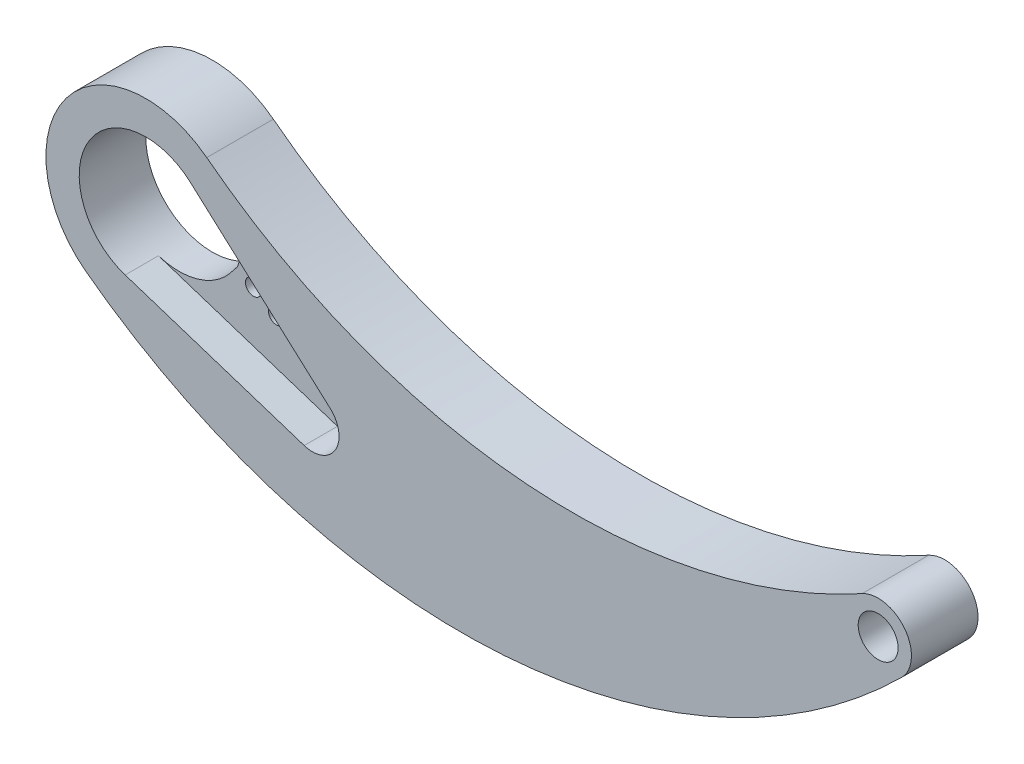
ISO-10303-21;
HEADER;
FILE_DESCRIPTION(('STEP AP214'),'2;1');
FILE_NAME('part.step','',(''),(''),'','','');
FILE_SCHEMA(('AUTOMOTIVE_DESIGN { 1 0 10303 214 1 1 1 1 }'));
ENDSEC;
DATA;
#1=APPLICATION_CONTEXT('core data for automotive mechanical design processes');
#2=APPLICATION_PROTOCOL_DEFINITION('international standard','automotive_design',2000,#1);
#3=PRODUCT_CONTEXT('',#1,'mechanical');
#4=PRODUCT('Part','Part','',(#3));
#5=PRODUCT_RELATED_PRODUCT_CATEGORY('part','',(#4));
#6=PRODUCT_DEFINITION_FORMATION('','',#4);
#7=PRODUCT_DEFINITION_CONTEXT('part definition',#1,'design');
#8=PRODUCT_DEFINITION('design','',#6,#7);
#9=PRODUCT_DEFINITION_SHAPE('','',#8);
#10=(LENGTH_UNIT() NAMED_UNIT(*) SI_UNIT(.MILLI.,.METRE.));
#11=(NAMED_UNIT(*) PLANE_ANGLE_UNIT() SI_UNIT($,.RADIAN.));
#12=(NAMED_UNIT(*) SI_UNIT($,.STERADIAN.) SOLID_ANGLE_UNIT());
#13=UNCERTAINTY_MEASURE_WITH_UNIT(LENGTH_MEASURE(1.E-05),#10,'distance_accuracy_value','');
#14=(GEOMETRIC_REPRESENTATION_CONTEXT(3) GLOBAL_UNCERTAINTY_ASSIGNED_CONTEXT((#13)) GLOBAL_UNIT_ASSIGNED_CONTEXT((#10,
#11,#12)) REPRESENTATION_CONTEXT('',''));
#15=CARTESIAN_POINT('',(0.,0.,0.));
#16=DIRECTION('',(0.,0.,1.));
#17=DIRECTION('',(1.,0.,0.));
#18=AXIS2_PLACEMENT_3D('',#15,#16,#17);
#19=CARTESIAN_POINT('',(0.,0.,5.));
#20=DIRECTION('',(0.,0.,-1.));
#21=DIRECTION('',(-1.,0.,0.));
#22=AXIS2_PLACEMENT_3D('',#19,#20,#21);
#23=CYLINDRICAL_SURFACE('',#22,5.);
#24=CARTESIAN_POINT('',(0.,0.,5.));
#25=DIRECTION('',(0.,0.,1.));
#26=DIRECTION('',(1.,0.,0.));
#27=AXIS2_PLACEMENT_3D('',#24,#25,#26);
#28=CIRCLE('',#27,5.);
#29=CARTESIAN_POINT('',(3.34451620108525,3.71674741954284,5.));
#30=VERTEX_POINT('',#29);
#31=CARTESIAN_POINT('',(-1.54653958423174,-4.75480970327986,5.));
#32=VERTEX_POINT('',#31);
#33=EDGE_CURVE('E186',#30,#32,#28,.T.);
#34=ORIENTED_EDGE('',*,*,#33,.T.);
#35=DIRECTION('',(0.,0.,1.));
#36=VECTOR('',#35,1.);
#37=CARTESIAN_POINT('',(-1.54653958423174,-4.75480970327986,2.5));
#38=LINE('',#37,#36);
#39=CARTESIAN_POINT('',(-1.54653958423174,-4.75480970327986,2.5));
#40=VERTEX_POINT('',#39);
#41=EDGE_CURVE('E162',#40,#32,#38,.T.);
#42=ORIENTED_EDGE('',*,*,#41,.F.);
#43=CARTESIAN_POINT('',(0.,0.,2.5));
#44=DIRECTION('',(0.,0.,1.));
#45=DIRECTION('',(1.,0.,0.));
#46=AXIS2_PLACEMENT_3D('',#43,#44,#45);
#47=CIRCLE('',#46,5.);
#48=CARTESIAN_POINT('',(4.19748369054172,-2.71682363572542,2.5));
#49=VERTEX_POINT('',#48);
#50=EDGE_CURVE('E133',#49,#40,#47,.F.);
#51=ORIENTED_EDGE('',*,*,#50,.F.);
#52=DIRECTION('',(0.,0.,1.));
#53=VECTOR('',#52,1.);
#54=CARTESIAN_POINT('',(4.19748369054172,-2.71682363572542,0.));
#55=LINE('',#54,#53);
#56=CARTESIAN_POINT('',(4.19748369054172,-2.71682363572542,0.));
#57=VERTEX_POINT('',#56);
#58=EDGE_CURVE('E170',#57,#49,#55,.T.);
#59=ORIENTED_EDGE('',*,*,#58,.F.);
#60=CARTESIAN_POINT('',(0.,0.,0.));
#61=DIRECTION('',(0.,0.,1.));
#62=DIRECTION('',(1.,0.,0.));
#63=AXIS2_PLACEMENT_3D('',#60,#61,#62);
#64=CIRCLE('',#63,5.);
#65=CARTESIAN_POINT('',(4.45158013141107,-2.27671569011729,0.));
#66=VERTEX_POINT('',#65);
#67=EDGE_CURVE('E203',#66,#57,#64,.T.);
#68=ORIENTED_EDGE('',*,*,#67,.F.);
#69=DIRECTION('',(0.,0.,1.));
#70=VECTOR('',#69,1.);
#71=CARTESIAN_POINT('',(4.45158013141106,-2.27671569011729,0.));
#72=LINE('',#71,#70);
#73=CARTESIAN_POINT('',(4.45158013141106,-2.27671569011729,2.5));
#74=VERTEX_POINT('',#73);
#75=EDGE_CURVE('E56',#74,#66,#72,.F.);
#76=ORIENTED_EDGE('',*,*,#75,.F.);
#77=CARTESIAN_POINT('',(0.,0.,2.5));
#78=DIRECTION('',(0.,0.,1.));
#79=DIRECTION('',(1.,0.,0.));
#80=AXIS2_PLACEMENT_3D('',#77,#78,#79);
#81=CIRCLE('',#80,5.);
#82=CARTESIAN_POINT('',(3.34451620108525,3.71674741954284,2.5));
#83=VERTEX_POINT('',#82);
#84=EDGE_CURVE('E49',#83,#74,#81,.F.);
#85=ORIENTED_EDGE('',*,*,#84,.F.);
#86=DIRECTION('',(0.,0.,1.));
#87=VECTOR('',#86,1.);
#88=CARTESIAN_POINT('',(3.34451620108525,3.71674741954284,2.5));
#89=LINE('',#88,#87);
#90=EDGE_CURVE('E165',#83,#30,#89,.T.);
#91=ORIENTED_EDGE('',*,*,#90,.T.);
#92=EDGE_LOOP('',(#34,#42,#51,#59,#68,#76,#85,#91));
#93=FACE_BOUND('',#92,.T.);
#94=ADVANCED_FACE('F34',(#93),#23,.F.);
#95=CARTESIAN_POINT('',(12.5140670846851,-7.22500000000001,-5.));
#96=DIRECTION('',(0.,0.,1.));
#97=DIRECTION('',(1.,0.,0.));
#98=AXIS2_PLACEMENT_3D('',#95,#96,#97);
#99=CYLINDRICAL_SURFACE('',#98,0.6);
#100=CARTESIAN_POINT('',(12.5140670846851,-7.22500000000001,0.));
#101=DIRECTION('',(0.,0.,1.));
#102=DIRECTION('',(1.,0.,0.));
#103=AXIS2_PLACEMENT_3D('',#100,#101,#102);
#104=CIRCLE('',#103,0.6);
#105=CARTESIAN_POINT('',(13.1140670846851,-7.22500000000001,0.));
#106=VERTEX_POINT('',#105);
#107=EDGE_CURVE('E164',#106,#106,#104,.T.);
#108=ORIENTED_EDGE('',*,*,#107,.F.);
#109=EDGE_LOOP('',(#108));
#110=FACE_BOUND('',#109,.T.);
#111=CARTESIAN_POINT('',(12.5140670846851,-7.22500000000001,2.5));
#112=DIRECTION('',(0.,0.,1.));
#113=DIRECTION('',(1.,0.,0.));
#114=AXIS2_PLACEMENT_3D('',#111,#112,#113);
#115=CIRCLE('',#114,0.6);
#116=CARTESIAN_POINT('',(13.1140670846851,-7.22500000000001,2.5));
#117=VERTEX_POINT('',#116);
#118=EDGE_CURVE('E122',#117,#117,#115,.F.);
#119=ORIENTED_EDGE('',*,*,#118,.F.);
#120=EDGE_LOOP('',(#119));
#121=FACE_BOUND('',#120,.T.);
#122=ADVANCED_FACE('F250',(#110,#121),#99,.F.);
#123=CARTESIAN_POINT('',(10.7820162771163,-6.22500000000001,-5.));
#124=DIRECTION('',(0.,0.,1.));
#125=DIRECTION('',(1.,0.,0.));
#126=AXIS2_PLACEMENT_3D('',#123,#124,#125);
#127=CYLINDRICAL_SURFACE('',#126,0.600000000000002);
#128=CARTESIAN_POINT('',(10.7820162771163,-6.22500000000001,0.));
#129=DIRECTION('',(0.,0.,1.));
#130=DIRECTION('',(1.,0.,0.));
#131=AXIS2_PLACEMENT_3D('',#128,#129,#130);
#132=CIRCLE('',#131,0.600000000000002);
#133=CARTESIAN_POINT('',(11.3820162771163,-6.22500000000001,0.));
#134=VERTEX_POINT('',#133);
#135=EDGE_CURVE('E218',#134,#134,#132,.T.);
#136=ORIENTED_EDGE('',*,*,#135,.F.);
#137=EDGE_LOOP('',(#136));
#138=FACE_BOUND('',#137,.T.);
#139=CARTESIAN_POINT('',(10.7820162771163,-6.22500000000001,2.5));
#140=DIRECTION('',(0.,0.,1.));
#141=DIRECTION('',(1.,0.,0.));
#142=AXIS2_PLACEMENT_3D('',#139,#140,#141);
#143=CIRCLE('',#142,0.600000000000002);
#144=CARTESIAN_POINT('',(11.3820162771163,-6.22500000000001,2.5));
#145=VERTEX_POINT('',#144);
#146=EDGE_CURVE('E155',#145,#145,#143,.F.);
#147=ORIENTED_EDGE('',*,*,#146,.F.);
#148=EDGE_LOOP('',(#147));
#149=FACE_BOUND('',#148,.T.);
#150=ADVANCED_FACE('F252',(#138,#149),#127,.F.);
#151=CARTESIAN_POINT('',(9.04996546954738,-5.22500000000001,-5.));
#152=DIRECTION('',(0.,0.,1.));
#153=DIRECTION('',(1.,0.,0.));
#154=AXIS2_PLACEMENT_3D('',#151,#152,#153);
#155=CYLINDRICAL_SURFACE('',#154,0.6);
#156=CARTESIAN_POINT('',(9.04996546954738,-5.22500000000001,0.));
#157=DIRECTION('',(0.,0.,1.));
#158=DIRECTION('',(1.,0.,0.));
#159=AXIS2_PLACEMENT_3D('',#156,#157,#158);
#160=CIRCLE('',#159,0.6);
#161=CARTESIAN_POINT('',(9.64996546954738,-5.22500000000001,0.));
#162=VERTEX_POINT('',#161);
#163=EDGE_CURVE('E221',#162,#162,#160,.T.);
#164=ORIENTED_EDGE('',*,*,#163,.F.);
#165=EDGE_LOOP('',(#164));
#166=FACE_BOUND('',#165,.T.);
#167=CARTESIAN_POINT('',(9.04996546954738,-5.22500000000001,2.5));
#168=DIRECTION('',(0.,0.,1.));
#169=DIRECTION('',(1.,0.,0.));
#170=AXIS2_PLACEMENT_3D('',#167,#168,#169);
#171=CIRCLE('',#170,0.6);
#172=CARTESIAN_POINT('',(9.64996546954738,-5.22500000000001,2.5));
#173=VERTEX_POINT('',#172);
#174=EDGE_CURVE('E152',#173,#173,#171,.F.);
#175=ORIENTED_EDGE('',*,*,#174,.F.);
#176=EDGE_LOOP('',(#175));
#177=FACE_BOUND('',#176,.T.);
#178=ADVANCED_FACE('F259',(#166,#177),#155,.F.);
#179=CARTESIAN_POINT('',(7.3179146619785,-4.22500000000001,-5.));
#180=DIRECTION('',(0.,0.,1.));
#181=DIRECTION('',(1.,0.,0.));
#182=AXIS2_PLACEMENT_3D('',#179,#180,#181);
#183=CYLINDRICAL_SURFACE('',#182,0.6);
#184=CARTESIAN_POINT('',(7.3179146619785,-4.22500000000001,0.));
#185=DIRECTION('',(0.,0.,1.));
#186=DIRECTION('',(1.,0.,0.));
#187=AXIS2_PLACEMENT_3D('',#184,#185,#186);
#188=CIRCLE('',#187,0.6);
#189=CARTESIAN_POINT('',(7.9179146619785,-4.22500000000001,0.));
#190=VERTEX_POINT('',#189);
#191=EDGE_CURVE('E224',#190,#190,#188,.T.);
#192=ORIENTED_EDGE('',*,*,#191,.F.);
#193=EDGE_LOOP('',(#192));
#194=FACE_BOUND('',#193,.T.);
#195=CARTESIAN_POINT('',(7.3179146619785,-4.22500000000001,2.5));
#196=DIRECTION('',(0.,0.,1.));
#197=DIRECTION('',(1.,0.,0.));
#198=AXIS2_PLACEMENT_3D('',#195,#196,#197);
#199=CIRCLE('',#198,0.6);
#200=CARTESIAN_POINT('',(7.9179146619785,-4.22500000000001,2.5));
#201=VERTEX_POINT('',#200);
#202=EDGE_CURVE('E149',#201,#201,#199,.F.);
#203=ORIENTED_EDGE('',*,*,#202,.F.);
#204=EDGE_LOOP('',(#203));
#205=FACE_BOUND('',#204,.T.);
#206=ADVANCED_FACE('F236',(#194,#205),#183,.F.);
#207=CARTESIAN_POINT('',(5.58586385440963,-3.22500000000001,-5.));
#208=DIRECTION('',(0.,0.,1.));
#209=DIRECTION('',(1.,0.,0.));
#210=AXIS2_PLACEMENT_3D('',#207,#208,#209);
#211=CYLINDRICAL_SURFACE('',#210,0.6);
#212=CARTESIAN_POINT('',(5.58586385440963,-3.22500000000001,0.));
#213=DIRECTION('',(0.,0.,1.));
#214=DIRECTION('',(1.,0.,0.));
#215=AXIS2_PLACEMENT_3D('',#212,#213,#214);
#216=CIRCLE('',#215,0.6);
#217=CARTESIAN_POINT('',(6.18586385440963,-3.22500000000001,0.));
#218=VERTEX_POINT('',#217);
#219=EDGE_CURVE('E171',#218,#218,#216,.T.);
#220=ORIENTED_EDGE('',*,*,#219,.F.);
#221=EDGE_LOOP('',(#220));
#222=FACE_BOUND('',#221,.T.);
#223=CARTESIAN_POINT('',(5.58586385440963,-3.22500000000001,2.5));
#224=DIRECTION('',(0.,0.,1.));
#225=DIRECTION('',(1.,0.,0.));
#226=AXIS2_PLACEMENT_3D('',#223,#224,#225);
#227=CIRCLE('',#226,0.6);
#228=CARTESIAN_POINT('',(6.18586385440963,-3.22500000000001,2.5));
#229=VERTEX_POINT('',#228);
#230=EDGE_CURVE('E146',#229,#229,#227,.F.);
#231=ORIENTED_EDGE('',*,*,#230,.F.);
#232=EDGE_LOOP('',(#231));
#233=FACE_BOUND('',#232,.T.);
#234=ADVANCED_FACE('F232',(#222,#233),#211,.F.);
#235=CARTESIAN_POINT('',(3.85381304684075,-2.225,-5.));
#236=DIRECTION('',(0.,0.,1.));
#237=DIRECTION('',(1.,0.,0.));
#238=AXIS2_PLACEMENT_3D('',#235,#236,#237);
#239=CYLINDRICAL_SURFACE('',#238,0.600000000000001);
#240=CARTESIAN_POINT('',(3.85381304684075,-2.225,2.5));
#241=DIRECTION('',(0.,0.,1.));
#242=DIRECTION('',(1.,0.,0.));
#243=AXIS2_PLACEMENT_3D('',#240,#241,#242);
#244=CIRCLE('',#243,0.600000000000001);
#245=EDGE_CURVE('E143',#74,#49,#244,.F.);
#246=ORIENTED_EDGE('',*,*,#245,.F.);
#247=ORIENTED_EDGE('',*,*,#75,.T.);
#248=CARTESIAN_POINT('',(3.85381304684075,-2.225,0.));
#249=DIRECTION('',(0.,0.,1.));
#250=DIRECTION('',(1.,0.,0.));
#251=AXIS2_PLACEMENT_3D('',#248,#249,#250);
#252=CIRCLE('',#251,0.600000000000001);
#253=EDGE_CURVE('E11',#57,#66,#252,.T.);
#254=ORIENTED_EDGE('',*,*,#253,.F.);
#255=ORIENTED_EDGE('',*,*,#58,.T.);
#256=EDGE_LOOP('',(#246,#247,#254,#255));
#257=FACE_BOUND('',#256,.T.);
#258=ADVANCED_FACE('F235',(#257),#239,.F.);
#259=CARTESIAN_POINT('',(23.681818181818,31.6136281942348,5.));
#260=DIRECTION('',(0.,0.,-1.));
#261=DIRECTION('',(-1.,0.,0.));
#262=AXIS2_PLACEMENT_3D('',#259,#260,#261);
#263=CYLINDRICAL_SURFACE('',#262,47.);
#264=CARTESIAN_POINT('',(23.681818181818,31.6136281942348,0.));
#265=DIRECTION('',(0.,0.,1.));
#266=DIRECTION('',(1.,0.,0.));
#267=AXIS2_PLACEMENT_3D('',#264,#265,#266);
#268=CIRCLE('',#267,47.);
#269=CARTESIAN_POINT('',(-4.4965477560414,-6.00258763181672,0.));
#270=VERTEX_POINT('',#269);
#271=CARTESIAN_POINT('',(56.7594484167518,-1.77604652776559,0.));
#272=VERTEX_POINT('',#271);
#273=EDGE_CURVE('E174',#270,#272,#268,.T.);
#274=ORIENTED_EDGE('',*,*,#273,.T.);
#275=DIRECTION('',(0.,0.,-1.));
#276=VECTOR('',#275,1.);
#277=CARTESIAN_POINT('',(56.7594484167518,-1.77604652776559,5.));
#278=LINE('',#277,#276);
#279=CARTESIAN_POINT('',(56.7594484167518,-1.77604652776559,5.));
#280=VERTEX_POINT('',#279);
#281=EDGE_CURVE('E42',#280,#272,#278,.T.);
#282=ORIENTED_EDGE('',*,*,#281,.F.);
#283=CARTESIAN_POINT('',(23.681818181818,31.6136281942348,5.));
#284=DIRECTION('',(0.,0.,1.));
#285=DIRECTION('',(1.,0.,0.));
#286=AXIS2_PLACEMENT_3D('',#283,#284,#285);
#287=CIRCLE('',#286,47.);
#288=CARTESIAN_POINT('',(-4.4965477560414,-6.00258763181672,5.));
#289=VERTEX_POINT('',#288);
#290=EDGE_CURVE('E175',#289,#280,#287,.T.);
#291=ORIENTED_EDGE('',*,*,#290,.F.);
#292=DIRECTION('',(0.,0.,-1.));
#293=VECTOR('',#292,1.);
#294=CARTESIAN_POINT('',(-4.4965477560414,-6.00258763181672,5.));
#295=LINE('',#294,#293);
#296=EDGE_CURVE('E192',#289,#270,#295,.T.);
#297=ORIENTED_EDGE('',*,*,#296,.T.);
#298=EDGE_LOOP('',(#274,#282,#291,#297));
#299=FACE_BOUND('',#298,.T.);
#300=ADVANCED_FACE('F36',(#299),#263,.T.);
#301=CARTESIAN_POINT('',(55.,4.04269619458676E-13,5.));
#302=DIRECTION('',(0.,0.,-1.));
#303=DIRECTION('',(-1.,0.,0.));
#304=AXIS2_PLACEMENT_3D('',#301,#302,#303);
#305=CYLINDRICAL_SURFACE('',#304,2.5);
#306=CARTESIAN_POINT('',(55.,4.04269619458676E-13,0.));
#307=DIRECTION('',(0.,0.,1.));
#308=DIRECTION('',(1.,0.,0.));
#309=AXIS2_PLACEMENT_3D('',#306,#307,#308);
#310=CIRCLE('',#309,2.5);
#311=CARTESIAN_POINT('',(53.7918660287081,2.18870105482961,0.));
#312=VERTEX_POINT('',#311);
#313=EDGE_CURVE('E195',#272,#312,#310,.T.);
#314=ORIENTED_EDGE('',*,*,#313,.T.);
#315=DIRECTION('',(0.,0.,-1.));
#316=VECTOR('',#315,1.);
#317=CARTESIAN_POINT('',(53.7918660287081,2.18870105482961,5.));
#318=LINE('',#317,#316);
#319=CARTESIAN_POINT('',(53.7918660287081,2.18870105482961,5.));
#320=VERTEX_POINT('',#319);
#321=EDGE_CURVE('E212',#320,#312,#318,.T.);
#322=ORIENTED_EDGE('',*,*,#321,.F.);
#323=CARTESIAN_POINT('',(55.,4.04269619458676E-13,5.));
#324=DIRECTION('',(0.,0.,1.));
#325=DIRECTION('',(1.,0.,0.));
#326=AXIS2_PLACEMENT_3D('',#323,#324,#325);
#327=CIRCLE('',#326,2.5);
#328=EDGE_CURVE('E178',#280,#320,#327,.T.);
#329=ORIENTED_EDGE('',*,*,#328,.F.);
#330=ORIENTED_EDGE('',*,*,#281,.T.);
#331=EDGE_LOOP('',(#314,#322,#329,#330));
#332=FACE_BOUND('',#331,.T.);
#333=ADVANCED_FACE('F283',(#332),#305,.T.);
#334=CARTESIAN_POINT('',(32.0454545454542,41.5853200417554,5.));
#335=DIRECTION('',(0.,0.,-1.));
#336=DIRECTION('',(-1.,0.,0.));
#337=AXIS2_PLACEMENT_3D('',#334,#335,#336);
#338=CYLINDRICAL_SURFACE('',#337,45.);
#339=CARTESIAN_POINT('',(32.0454545454542,41.5853200417554,0.));
#340=DIRECTION('',(0.,0.,1.));
#341=DIRECTION('',(1.,0.,0.));
#342=AXIS2_PLACEMENT_3D('',#339,#340,#341);
#343=CIRCLE('',#342,45.);
#344=CARTESIAN_POINT('',(4.57792207792204,5.94076000596506,0.));
#345=VERTEX_POINT('',#344);
#346=EDGE_CURVE('E198',#345,#312,#343,.T.);
#347=ORIENTED_EDGE('',*,*,#346,.F.);
#348=DIRECTION('',(0.,0.,-1.));
#349=VECTOR('',#348,1.);
#350=CARTESIAN_POINT('',(4.57792207792204,5.94076000596506,5.));
#351=LINE('',#350,#349);
#352=CARTESIAN_POINT('',(4.57792207792204,5.94076000596506,5.));
#353=VERTEX_POINT('',#352);
#354=EDGE_CURVE('E210',#353,#345,#351,.T.);
#355=ORIENTED_EDGE('',*,*,#354,.F.);
#356=CARTESIAN_POINT('',(32.0454545454542,41.5853200417554,5.));
#357=DIRECTION('',(0.,0.,1.));
#358=DIRECTION('',(1.,0.,0.));
#359=AXIS2_PLACEMENT_3D('',#356,#357,#358);
#360=CIRCLE('',#359,45.);
#361=EDGE_CURVE('E181',#353,#320,#360,.T.);
#362=ORIENTED_EDGE('',*,*,#361,.T.);
#363=ORIENTED_EDGE('',*,*,#321,.T.);
#364=EDGE_LOOP('',(#347,#355,#362,#363));
#365=FACE_BOUND('',#364,.T.);
#366=ADVANCED_FACE('F280',(#365),#338,.F.);
#367=CARTESIAN_POINT('',(0.,0.,5.));
#368=DIRECTION('',(0.,0.,-1.));
#369=DIRECTION('',(-1.,0.,0.));
#370=AXIS2_PLACEMENT_3D('',#367,#368,#369);
#371=CYLINDRICAL_SURFACE('',#370,7.5);
#372=CARTESIAN_POINT('',(0.,0.,0.));
#373=DIRECTION('',(0.,0.,1.));
#374=DIRECTION('',(1.,0.,0.));
#375=AXIS2_PLACEMENT_3D('',#372,#373,#374);
#376=CIRCLE('',#375,7.5);
#377=EDGE_CURVE('E201',#345,#270,#376,.T.);
#378=ORIENTED_EDGE('',*,*,#377,.T.);
#379=ORIENTED_EDGE('',*,*,#296,.F.);
#380=CARTESIAN_POINT('',(0.,0.,5.));
#381=DIRECTION('',(0.,0.,1.));
#382=DIRECTION('',(1.,0.,0.));
#383=AXIS2_PLACEMENT_3D('',#380,#381,#382);
#384=CIRCLE('',#383,7.5);
#385=EDGE_CURVE('E184',#353,#289,#384,.T.);
#386=ORIENTED_EDGE('',*,*,#385,.F.);
#387=ORIENTED_EDGE('',*,*,#354,.T.);
#388=EDGE_LOOP('',(#378,#379,#386,#387));
#389=FACE_BOUND('',#388,.T.);
#390=ADVANCED_FACE('F275',(#389),#371,.T.);
#391=CARTESIAN_POINT('',(55.,4.04269619458676E-13,5.));
#392=DIRECTION('',(0.,0.,-1.));
#393=DIRECTION('',(-1.,0.,0.));
#394=AXIS2_PLACEMENT_3D('',#391,#392,#393);
#395=CYLINDRICAL_SURFACE('',#394,1.5);
#396=CARTESIAN_POINT('',(55.,4.04269619458676E-13,5.));
#397=DIRECTION('',(0.,0.,1.));
#398=DIRECTION('',(1.,0.,0.));
#399=AXIS2_PLACEMENT_3D('',#396,#397,#398);
#400=CIRCLE('',#399,1.5);
#401=CARTESIAN_POINT('',(56.5,4.04269619458676E-13,5.));
#402=VERTEX_POINT('',#401);
#403=EDGE_CURVE('E189',#402,#402,#400,.T.);
#404=ORIENTED_EDGE('',*,*,#403,.T.);
#405=EDGE_LOOP('',(#404));
#406=FACE_BOUND('',#405,.T.);
#407=CARTESIAN_POINT('',(55.,4.04269619458676E-13,0.));
#408=DIRECTION('',(0.,0.,1.));
#409=DIRECTION('',(1.,0.,0.));
#410=AXIS2_PLACEMENT_3D('',#407,#408,#409);
#411=CIRCLE('',#410,1.5);
#412=CARTESIAN_POINT('',(56.5,4.04269619458676E-13,0.));
#413=VERTEX_POINT('',#412);
#414=EDGE_CURVE('E179',#413,#413,#411,.T.);
#415=ORIENTED_EDGE('',*,*,#414,.F.);
#416=EDGE_LOOP('',(#415));
#417=FACE_BOUND('',#416,.T.);
#418=ADVANCED_FACE('F270',(#406,#417),#395,.F.);
#419=CARTESIAN_POINT('',(0.,0.,5.));
#420=DIRECTION('',(0.,0.,1.));
#421=DIRECTION('',(1.,0.,0.));
#422=AXIS2_PLACEMENT_3D('',#419,#420,#421);
#423=PLANE('',#422);
#424=DIRECTION('',(0.950961940655972,-0.309307916846348,0.));
#425=VECTOR('',#424,1.);
#426=CARTESIAN_POINT('',(-1.54653958423174,-4.75480970327986,5.));
#427=LINE('',#426,#425);
#428=CARTESIAN_POINT('',(11.8954512509924,-9.12692388131196,5.));
#429=VERTEX_POINT('',#428);
#430=EDGE_CURVE('E117',#32,#429,#427,.T.);
#431=ORIENTED_EDGE('',*,*,#430,.F.);
#432=ORIENTED_EDGE('',*,*,#33,.F.);
#433=DIRECTION('',(0.743349483908567,-0.668903240217049,0.));
#434=VECTOR('',#433,1.);
#435=CARTESIAN_POINT('',(3.34451620108525,3.71674741954284,5.));
#436=LINE('',#435,#434);
#437=CARTESIAN_POINT('',(13.8518735651192,-5.73830103218288,5.));
#438=VERTEX_POINT('',#437);
#439=EDGE_CURVE('E135',#30,#438,#436,.T.);
#440=ORIENTED_EDGE('',*,*,#439,.T.);
#441=CARTESIAN_POINT('',(12.5140670846851,-7.22500000000001,5.));
#442=DIRECTION('',(0.,0.,1.));
#443=DIRECTION('',(1.,0.,0.));
#444=AXIS2_PLACEMENT_3D('',#441,#442,#443);
#445=CIRCLE('',#444,2.);
#446=EDGE_CURVE('E138',#429,#438,#445,.T.);
#447=ORIENTED_EDGE('',*,*,#446,.F.);
#448=EDGE_LOOP('',(#431,#432,#440,#447));
#449=FACE_BOUND('',#448,.T.);
#450=ORIENTED_EDGE('',*,*,#290,.T.);
#451=ORIENTED_EDGE('',*,*,#328,.T.);
#452=ORIENTED_EDGE('',*,*,#361,.F.);
#453=ORIENTED_EDGE('',*,*,#385,.T.);
#454=EDGE_LOOP('',(#450,#451,#452,#453));
#455=FACE_BOUND('',#454,.T.);
#456=ORIENTED_EDGE('',*,*,#403,.F.);
#457=EDGE_LOOP('',(#456));
#458=FACE_BOUND('',#457,.T.);
#459=ADVANCED_FACE('F267',(#449,#455,#458),#423,.T.);
#460=CARTESIAN_POINT('',(0.,0.,0.));
#461=DIRECTION('',(0.,0.,1.));
#462=DIRECTION('',(1.,0.,0.));
#463=AXIS2_PLACEMENT_3D('',#460,#461,#462);
#464=PLANE('',#463);
#465=ORIENTED_EDGE('',*,*,#219,.T.);
#466=EDGE_LOOP('',(#465));
#467=FACE_BOUND('',#466,.T.);
#468=ORIENTED_EDGE('',*,*,#191,.T.);
#469=EDGE_LOOP('',(#468));
#470=FACE_BOUND('',#469,.T.);
#471=ORIENTED_EDGE('',*,*,#163,.T.);
#472=EDGE_LOOP('',(#471));
#473=FACE_BOUND('',#472,.T.);
#474=ORIENTED_EDGE('',*,*,#135,.T.);
#475=EDGE_LOOP('',(#474));
#476=FACE_BOUND('',#475,.T.);
#477=ORIENTED_EDGE('',*,*,#107,.T.);
#478=EDGE_LOOP('',(#477));
#479=FACE_BOUND('',#478,.T.);
#480=ORIENTED_EDGE('',*,*,#273,.F.);
#481=ORIENTED_EDGE('',*,*,#377,.F.);
#482=ORIENTED_EDGE('',*,*,#346,.T.);
#483=ORIENTED_EDGE('',*,*,#313,.F.);
#484=EDGE_LOOP('',(#480,#481,#482,#483));
#485=FACE_BOUND('',#484,.T.);
#486=ORIENTED_EDGE('',*,*,#67,.T.);
#487=ORIENTED_EDGE('',*,*,#253,.T.);
#488=EDGE_LOOP('',(#486,#487));
#489=FACE_BOUND('',#488,.T.);
#490=ORIENTED_EDGE('',*,*,#414,.T.);
#491=EDGE_LOOP('',(#490));
#492=FACE_BOUND('',#491,.T.);
#493=ADVANCED_FACE('F229',(#467,#470,#473,#476,#479,#485,#489,#492),#464,.F.);
#494=CARTESIAN_POINT('',(-1.54653958423174,-4.75480970327986,2.5));
#495=DIRECTION('',(-0.309307916846349,-0.950961940655972,0.));
#496=DIRECTION('',(0.950961940655972,-0.309307916846349,0.));
#497=AXIS2_PLACEMENT_3D('',#494,#495,#496);
#498=PLANE('',#497);
#499=ORIENTED_EDGE('',*,*,#430,.T.);
#500=DIRECTION('',(0.,0.,1.));
#501=VECTOR('',#500,1.);
#502=CARTESIAN_POINT('',(11.8954512509924,-9.12692388131196,2.5));
#503=LINE('',#502,#501);
#504=CARTESIAN_POINT('',(11.8954512509924,-9.12692388131196,2.5));
#505=VERTEX_POINT('',#504);
#506=EDGE_CURVE('E110',#505,#429,#503,.T.);
#507=ORIENTED_EDGE('',*,*,#506,.F.);
#508=DIRECTION('',(0.950961940655972,-0.309307916846348,0.));
#509=VECTOR('',#508,1.);
#510=CARTESIAN_POINT('',(-1.54653958423174,-4.75480970327986,2.5));
#511=LINE('',#510,#509);
#512=EDGE_CURVE('E114',#40,#505,#511,.T.);
#513=ORIENTED_EDGE('',*,*,#512,.F.);
#514=ORIENTED_EDGE('',*,*,#41,.T.);
#515=EDGE_LOOP('',(#499,#507,#513,#514));
#516=FACE_BOUND('',#515,.T.);
#517=ADVANCED_FACE('F112',(#516),#498,.F.);
#518=CARTESIAN_POINT('',(3.34451620108525,3.71674741954284,2.5));
#519=DIRECTION('',(-0.668903240217049,-0.743349483908567,0.));
#520=DIRECTION('',(0.743349483908567,-0.668903240217049,0.));
#521=AXIS2_PLACEMENT_3D('',#518,#519,#520);
#522=PLANE('',#521);
#523=ORIENTED_EDGE('',*,*,#439,.F.);
#524=ORIENTED_EDGE('',*,*,#90,.F.);
#525=DIRECTION('',(0.743349483908567,-0.668903240217049,0.));
#526=VECTOR('',#525,1.);
#527=CARTESIAN_POINT('',(3.34451620108525,3.71674741954284,2.5));
#528=LINE('',#527,#526);
#529=CARTESIAN_POINT('',(13.8518735651192,-5.73830103218288,2.5));
#530=VERTEX_POINT('',#529);
#531=EDGE_CURVE('E128',#83,#530,#528,.T.);
#532=ORIENTED_EDGE('',*,*,#531,.T.);
#533=DIRECTION('',(0.,0.,1.));
#534=VECTOR('',#533,1.);
#535=CARTESIAN_POINT('',(13.8518735651192,-5.73830103218288,2.5));
#536=LINE('',#535,#534);
#537=EDGE_CURVE('E121',#530,#438,#536,.T.);
#538=ORIENTED_EDGE('',*,*,#537,.T.);
#539=EDGE_LOOP('',(#523,#524,#532,#538));
#540=FACE_BOUND('',#539,.T.);
#541=ADVANCED_FACE('F362',(#540),#522,.T.);
#542=CARTESIAN_POINT('',(12.5140670846851,-7.22500000000001,2.5));
#543=DIRECTION('',(0.,0.,1.));
#544=DIRECTION('',(1.,0.,0.));
#545=AXIS2_PLACEMENT_3D('',#542,#543,#544);
#546=CYLINDRICAL_SURFACE('',#545,2.);
#547=ORIENTED_EDGE('',*,*,#446,.T.);
#548=ORIENTED_EDGE('',*,*,#537,.F.);
#549=CARTESIAN_POINT('',(12.5140670846851,-7.22500000000001,2.5));
#550=DIRECTION('',(0.,0.,1.));
#551=DIRECTION('',(1.,0.,0.));
#552=AXIS2_PLACEMENT_3D('',#549,#550,#551);
#553=CIRCLE('',#552,2.);
#554=EDGE_CURVE('E126',#505,#530,#553,.T.);
#555=ORIENTED_EDGE('',*,*,#554,.F.);
#556=ORIENTED_EDGE('',*,*,#506,.T.);
#557=EDGE_LOOP('',(#547,#548,#555,#556));
#558=FACE_BOUND('',#557,.T.);
#559=ADVANCED_FACE('F127',(#558),#546,.F.);
#560=CARTESIAN_POINT('',(0.,0.,2.5));
#561=DIRECTION('',(0.,0.,1.));
#562=DIRECTION('',(1.,0.,0.));
#563=AXIS2_PLACEMENT_3D('',#560,#561,#562);
#564=PLANE('',#563);
#565=ORIENTED_EDGE('',*,*,#512,.T.);
#566=ORIENTED_EDGE('',*,*,#554,.T.);
#567=ORIENTED_EDGE('',*,*,#531,.F.);
#568=ORIENTED_EDGE('',*,*,#84,.T.);
#569=ORIENTED_EDGE('',*,*,#245,.T.);
#570=ORIENTED_EDGE('',*,*,#50,.T.);
#571=EDGE_LOOP('',(#565,#566,#567,#568,#569,#570));
#572=FACE_BOUND('',#571,.T.);
#573=ORIENTED_EDGE('',*,*,#230,.T.);
#574=EDGE_LOOP('',(#573));
#575=FACE_BOUND('',#574,.T.);
#576=ORIENTED_EDGE('',*,*,#202,.T.);
#577=EDGE_LOOP('',(#576));
#578=FACE_BOUND('',#577,.T.);
#579=ORIENTED_EDGE('',*,*,#174,.T.);
#580=EDGE_LOOP('',(#579));
#581=FACE_BOUND('',#580,.T.);
#582=ORIENTED_EDGE('',*,*,#146,.T.);
#583=EDGE_LOOP('',(#582));
#584=FACE_BOUND('',#583,.T.);
#585=ORIENTED_EDGE('',*,*,#118,.T.);
#586=EDGE_LOOP('',(#585));
#587=FACE_BOUND('',#586,.T.);
#588=ADVANCED_FACE('F130',(#572,#575,#578,#581,#584,#587),#564,.T.);
#589=CLOSED_SHELL('',(#94,#122,#150,#178,#206,#234,#258,#300,#333,#366,#390,#418,#459,#493,#517,
#541,#559,#588));
#590=MANIFOLD_SOLID_BREP('B2',#589);
#591=ADVANCED_BREP_SHAPE_REPRESENTATION('',(#18,#590),#14);
#592=SHAPE_DEFINITION_REPRESENTATION(#9,#591);
ENDSEC;
END-ISO-10303-21;
